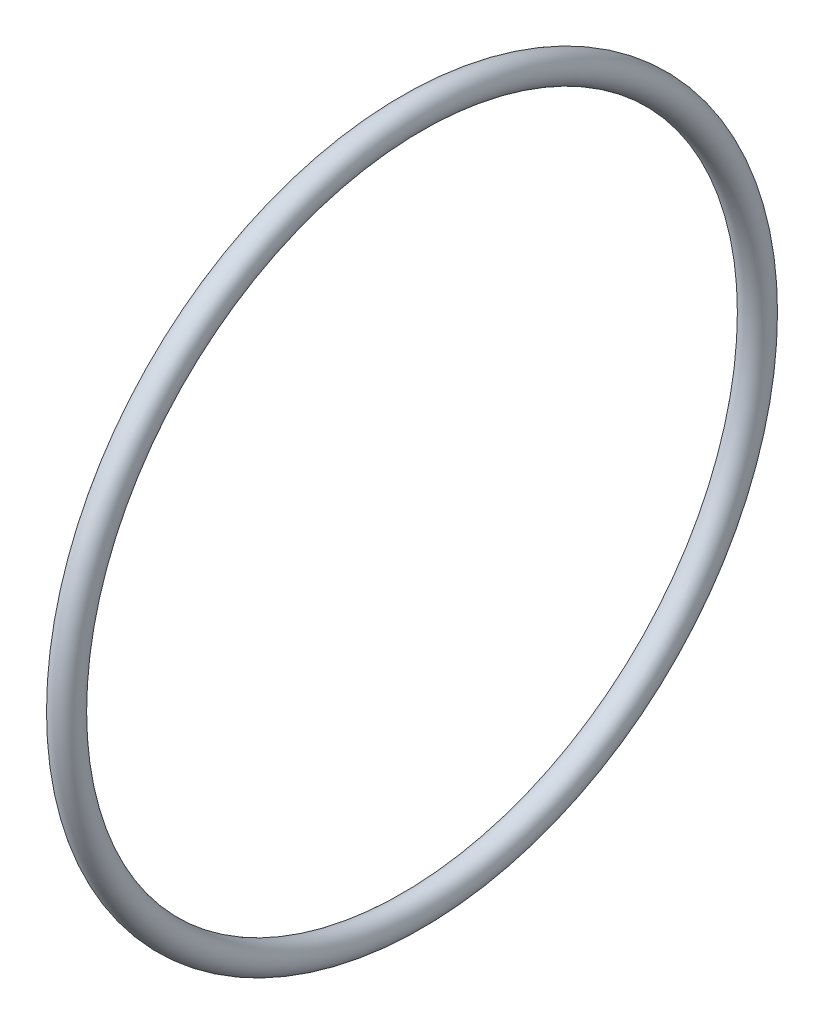
ISO-10303-21;
HEADER;
FILE_DESCRIPTION(('STEP AP214'),'2;1');
FILE_NAME('part.step','',(''),(''),'','','');
FILE_SCHEMA(('AUTOMOTIVE_DESIGN { 1 0 10303 214 1 1 1 1 }'));
ENDSEC;
DATA;
#1=APPLICATION_CONTEXT('core data for automotive mechanical design processes');
#2=APPLICATION_PROTOCOL_DEFINITION('international standard','automotive_design',2000,#1);
#3=PRODUCT_CONTEXT('',#1,'mechanical');
#4=PRODUCT('Part','Part','',(#3));
#5=PRODUCT_RELATED_PRODUCT_CATEGORY('part','',(#4));
#6=PRODUCT_DEFINITION_FORMATION('','',#4);
#7=PRODUCT_DEFINITION_CONTEXT('part definition',#1,'design');
#8=PRODUCT_DEFINITION('design','',#6,#7);
#9=PRODUCT_DEFINITION_SHAPE('','',#8);
#10=(LENGTH_UNIT() NAMED_UNIT(*) SI_UNIT(.MILLI.,.METRE.));
#11=(NAMED_UNIT(*) PLANE_ANGLE_UNIT() SI_UNIT($,.RADIAN.));
#12=(NAMED_UNIT(*) SI_UNIT($,.STERADIAN.) SOLID_ANGLE_UNIT());
#13=UNCERTAINTY_MEASURE_WITH_UNIT(LENGTH_MEASURE(1.E-05),#10,'distance_accuracy_value','');
#14=(GEOMETRIC_REPRESENTATION_CONTEXT(3) GLOBAL_UNCERTAINTY_ASSIGNED_CONTEXT((#13)) GLOBAL_UNIT_ASSIGNED_CONTEXT((#10,
#11,#12)) REPRESENTATION_CONTEXT('',''));
#15=CARTESIAN_POINT('',(0.,0.,0.));
#16=DIRECTION('',(0.,0.,1.));
#17=DIRECTION('',(1.,0.,0.));
#18=AXIS2_PLACEMENT_3D('',#15,#16,#17);
#19=CARTESIAN_POINT('',(0.,0.,0.));
#20=DIRECTION('',(-1.,0.,0.));
#21=DIRECTION('',(0.,0.,1.));
#22=AXIS2_PLACEMENT_3D('',#19,#20,#21);
#23=TOROIDAL_SURFACE('',#22,36.5,1.5);
#24=CARTESIAN_POINT('',(0.,0.,38.));
#25=VERTEX_POINT('',#24);
#26=VERTEX_LOOP('',#25);
#27=FACE_BOUND('',#26,.T.);
#28=ADVANCED_FACE('F35',(#27),#23,.T.);
#29=CLOSED_SHELL('',(#28));
#30=MANIFOLD_SOLID_BREP('B2',#29);
#31=ADVANCED_BREP_SHAPE_REPRESENTATION('',(#18,#30),#14);
#32=SHAPE_DEFINITION_REPRESENTATION(#9,#31);
ENDSEC;
END-ISO-10303-21;
